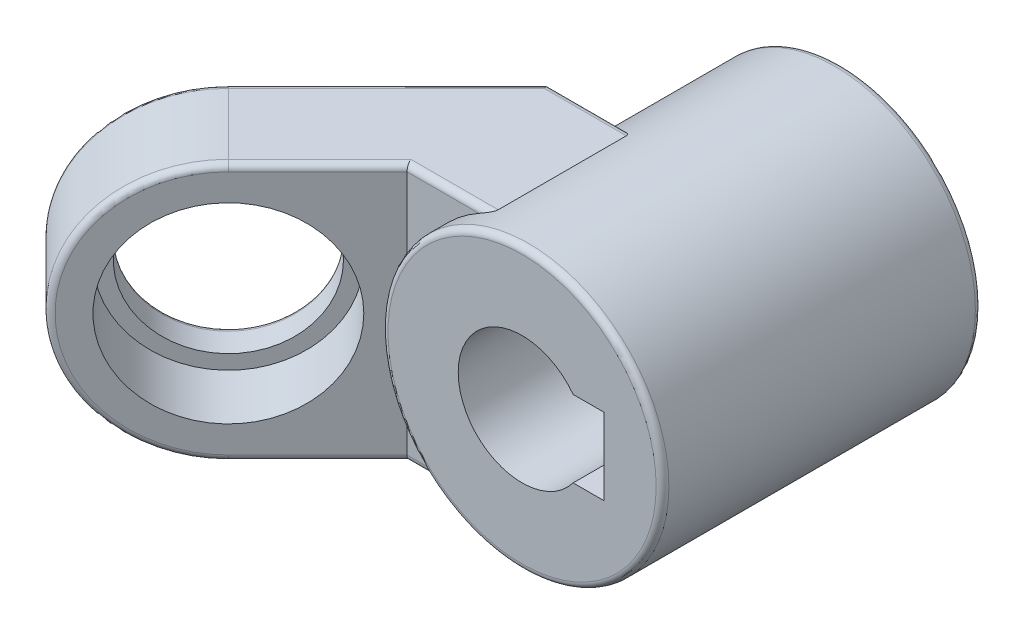
ISO-10303-21;
HEADER;
FILE_DESCRIPTION(('STEP AP214'),'2;1');
FILE_NAME('part.step','',(''),(''),'','','');
FILE_SCHEMA(('AUTOMOTIVE_DESIGN { 1 0 10303 214 1 1 1 1 }'));
ENDSEC;
DATA;
#1=APPLICATION_CONTEXT('core data for automotive mechanical design processes');
#2=APPLICATION_PROTOCOL_DEFINITION('international standard','automotive_design',2000,#1);
#3=PRODUCT_CONTEXT('',#1,'mechanical');
#4=PRODUCT('Part','Part','',(#3));
#5=PRODUCT_RELATED_PRODUCT_CATEGORY('part','',(#4));
#6=PRODUCT_DEFINITION_FORMATION('','',#4);
#7=PRODUCT_DEFINITION_CONTEXT('part definition',#1,'design');
#8=PRODUCT_DEFINITION('design','',#6,#7);
#9=PRODUCT_DEFINITION_SHAPE('','',#8);
#10=(LENGTH_UNIT() NAMED_UNIT(*) SI_UNIT(.MILLI.,.METRE.));
#11=(NAMED_UNIT(*) PLANE_ANGLE_UNIT() SI_UNIT($,.RADIAN.));
#12=(NAMED_UNIT(*) SI_UNIT($,.STERADIAN.) SOLID_ANGLE_UNIT());
#13=UNCERTAINTY_MEASURE_WITH_UNIT(LENGTH_MEASURE(1.E-05),#10,'distance_accuracy_value','');
#14=(GEOMETRIC_REPRESENTATION_CONTEXT(3) GLOBAL_UNCERTAINTY_ASSIGNED_CONTEXT((#13)) GLOBAL_UNIT_ASSIGNED_CONTEXT((#10,
#11,#12)) REPRESENTATION_CONTEXT('',''));
#15=CARTESIAN_POINT('',(0.,0.,0.));
#16=DIRECTION('',(0.,0.,1.));
#17=DIRECTION('',(1.,0.,0.));
#18=AXIS2_PLACEMENT_3D('',#15,#16,#17);
#19=CARTESIAN_POINT('',(-61.3061579288735,20.2,63.2609560310627));
#20=DIRECTION('',(-0.707106781186547,0.,-0.707106781186548));
#21=DIRECTION('',(-0.707106781186548,0.,0.707106781186547));
#22=AXIS2_PLACEMENT_3D('',#19,#20,#21);
#23=PLANE('',#22);
#24=CARTESIAN_POINT('',(-47.0226009489052,0.,48.9773990510944));
#25=DIRECTION('',(-0.707106781186547,0.,-0.707106781186548));
#26=DIRECTION('',(-0.707106781186548,0.,0.707106781186547));
#27=AXIS2_PLACEMENT_3D('',#24,#25,#26);
#28=CIRCLE('',#27,13.75);
#29=CARTESIAN_POINT('',(-56.7453191902202,0.,58.7001172924094));
#30=VERTEX_POINT('',#29);
#31=EDGE_CURVE('E219',#30,#30,#28,.F.);
#32=ORIENTED_EDGE('',*,*,#31,.T.);
#33=EDGE_LOOP('',(#32));
#34=FACE_BOUND('',#33,.T.);
#35=DIRECTION('',(0.,-1.,0.));
#36=VECTOR('',#35,1.);
#37=CARTESIAN_POINT('',(-22.,20.2,23.9547981021892));
#38=LINE('',#37,#36);
#39=CARTESIAN_POINT('',(-22.,0.,23.9547981021892));
#40=VERTEX_POINT('',#39);
#41=CARTESIAN_POINT('',(-22.,-19.2,23.9547981021892));
#42=VERTEX_POINT('',#41);
#43=EDGE_CURVE('E199',#40,#42,#38,.T.);
#44=ORIENTED_EDGE('',*,*,#43,.T.);
#45=DIRECTION('',(0.707106781186548,0.,-0.707106781186547));
#46=VECTOR('',#45,1.);
#47=CARTESIAN_POINT('',(-47.0226009489051,-19.2,48.9773990510943));
#48=LINE('',#47,#46);
#49=CARTESIAN_POINT('',(-47.0226009489051,-19.2,48.9773990510943));
#50=VERTEX_POINT('',#49);
#51=EDGE_CURVE('E236',#42,#50,#48,.F.);
#52=ORIENTED_EDGE('',*,*,#51,.T.);
#53=CARTESIAN_POINT('',(-47.0226009489051,0.,48.9773990510943));
#54=DIRECTION('',(-0.707106781186547,0.,-0.707106781186548));
#55=DIRECTION('',(-0.707106781186548,0.,0.707106781186547));
#56=AXIS2_PLACEMENT_3D('',#53,#54,#55);
#57=CIRCLE('',#56,19.2);
#58=CARTESIAN_POINT('',(-47.0226009489051,19.2,48.9773990510943));
#59=VERTEX_POINT('',#58);
#60=EDGE_CURVE('E234',#50,#59,#57,.T.);
#61=ORIENTED_EDGE('',*,*,#60,.T.);
#62=DIRECTION('',(0.707106781186548,0.,-0.707106781186547));
#63=VECTOR('',#62,1.);
#64=CARTESIAN_POINT('',(-61.3061579288735,19.2,63.2609560310627));
#65=LINE('',#64,#63);
#66=CARTESIAN_POINT('',(-22.,19.2,23.9547981021892));
#67=VERTEX_POINT('',#66);
#68=EDGE_CURVE('E232',#59,#67,#65,.T.);
#69=ORIENTED_EDGE('',*,*,#68,.T.);
#70=EDGE_CURVE('E205',#67,#40,#38,.T.);
#71=ORIENTED_EDGE('',*,*,#70,.T.);
#72=EDGE_LOOP('',(#44,#52,#61,#69,#71));
#73=FACE_BOUND('',#72,.T.);
#74=ADVANCED_FACE('F40',(#34,#73),#23,.T.);
#75=CARTESIAN_POINT('',(-35.9917351623951,20.2,60.0082648376045));
#76=DIRECTION('',(0.707106781186544,0.,0.707106781186551));
#77=DIRECTION('',(0.707106781186551,0.,-0.707106781186544));
#78=AXIS2_PLACEMENT_3D('',#75,#76,#77);
#79=PLANE('',#78);
#80=CARTESIAN_POINT('',(-35.991735162395,0.,60.0082648376046));
#81=DIRECTION('',(0.707106781186544,0.,0.707106781186551));
#82=DIRECTION('',(0.707106781186551,0.,-0.707106781186544));
#83=AXIS2_PLACEMENT_3D('',#80,#81,#82);
#84=CIRCLE('',#83,15.);
#85=CARTESIAN_POINT('',(-25.3851334445968,0.,49.4016631198064));
#86=VERTEX_POINT('',#85);
#87=EDGE_CURVE('E398',#86,#86,#84,.T.);
#88=ORIENTED_EDGE('',*,*,#87,.F.);
#89=EDGE_LOOP('',(#88));
#90=FACE_BOUND('',#89,.T.);
#91=DIRECTION('',(0.,-1.,0.));
#92=VECTOR('',#91,1.);
#93=CARTESIAN_POINT('',(-22.,20.2,46.0165296752096));
#94=LINE('',#93,#92);
#95=CARTESIAN_POINT('',(-22.,19.2,46.0165296752096));
#96=VERTEX_POINT('',#95);
#97=CARTESIAN_POINT('',(-22.,0.,46.0165296752096));
#98=VERTEX_POINT('',#97);
#99=EDGE_CURVE('E200',#96,#98,#94,.T.);
#100=ORIENTED_EDGE('',*,*,#99,.F.);
#101=DIRECTION('',(-0.707106781186551,0.,0.707106781186544));
#102=VECTOR('',#101,1.);
#103=CARTESIAN_POINT('',(-35.9917351623951,19.2,60.0082648376045));
#104=LINE('',#103,#102);
#105=CARTESIAN_POINT('',(-35.991735162395,19.2,60.0082648376045));
#106=VERTEX_POINT('',#105);
#107=EDGE_CURVE('E246',#96,#106,#104,.T.);
#108=ORIENTED_EDGE('',*,*,#107,.T.);
#109=CARTESIAN_POINT('',(-35.9917351623951,0.,60.0082648376045));
#110=DIRECTION('',(0.707106781186544,0.,0.707106781186551));
#111=DIRECTION('',(0.707106781186551,0.,-0.707106781186544));
#112=AXIS2_PLACEMENT_3D('',#109,#110,#111);
#113=CIRCLE('',#112,19.2);
#114=CARTESIAN_POINT('',(-35.991735162395,-19.2,60.0082648376045));
#115=VERTEX_POINT('',#114);
#116=EDGE_CURVE('E244',#106,#115,#113,.T.);
#117=ORIENTED_EDGE('',*,*,#116,.T.);
#118=DIRECTION('',(-0.707106781186551,0.,0.707106781186544));
#119=VECTOR('',#118,1.);
#120=CARTESIAN_POINT('',(-22.,-19.2,46.0165296752096));
#121=LINE('',#120,#119);
#122=CARTESIAN_POINT('',(-22.,-19.2,46.0165296752096));
#123=VERTEX_POINT('',#122);
#124=EDGE_CURVE('E242',#115,#123,#121,.F.);
#125=ORIENTED_EDGE('',*,*,#124,.T.);
#126=EDGE_CURVE('E204',#98,#123,#94,.T.);
#127=ORIENTED_EDGE('',*,*,#126,.F.);
#128=EDGE_LOOP('',(#100,#108,#117,#125,#127));
#129=FACE_BOUND('',#128,.T.);
#130=ADVANCED_FACE('F354',(#90,#129),#79,.T.);
#131=CARTESIAN_POINT('',(12.8,-6.,74.2928218175727));
#132=DIRECTION('',(0.,-1.,0.));
#133=DIRECTION('',(0.,0.,-1.));
#134=AXIS2_PLACEMENT_3D('',#131,#132,#133);
#135=PLANE('',#134);
#136=DIRECTION('',(1.,0.,0.));
#137=VECTOR('',#136,1.);
#138=CARTESIAN_POINT('',(12.8,-6.,2.));
#139=LINE('',#138,#137);
#140=CARTESIAN_POINT('',(8.,-6.,2.));
#141=VERTEX_POINT('',#140);
#142=CARTESIAN_POINT('',(12.8,-6.,2.));
#143=VERTEX_POINT('',#142);
#144=EDGE_CURVE('E165',#141,#143,#139,.T.);
#145=ORIENTED_EDGE('',*,*,#144,.F.);
#146=DIRECTION('',(0.,0.,-1.));
#147=VECTOR('',#146,1.);
#148=CARTESIAN_POINT('',(8.,-6.,74.2928218175727));
#149=LINE('',#148,#147);
#150=CARTESIAN_POINT('',(8.,-6.,50.));
#151=VERTEX_POINT('',#150);
#152=EDGE_CURVE('E179',#151,#141,#149,.T.);
#153=ORIENTED_EDGE('',*,*,#152,.F.);
#154=DIRECTION('',(-1.,0.,0.));
#155=VECTOR('',#154,1.);
#156=CARTESIAN_POINT('',(12.8,-6.,50.));
#157=LINE('',#156,#155);
#158=CARTESIAN_POINT('',(12.8,-6.,50.));
#159=VERTEX_POINT('',#158);
#160=EDGE_CURVE('E190',#159,#151,#157,.T.);
#161=ORIENTED_EDGE('',*,*,#160,.F.);
#162=DIRECTION('',(0.,0.,-1.));
#163=VECTOR('',#162,1.);
#164=CARTESIAN_POINT('',(12.8,-6.,74.2928218175727));
#165=LINE('',#164,#163);
#166=EDGE_CURVE('E182',#159,#143,#165,.T.);
#167=ORIENTED_EDGE('',*,*,#166,.T.);
#168=EDGE_LOOP('',(#145,#153,#161,#167));
#169=FACE_BOUND('',#168,.T.);
#170=ADVANCED_FACE('F178',(#169),#135,.F.);
#171=CARTESIAN_POINT('',(12.8,-6.,74.2928218175727));
#172=DIRECTION('',(1.,0.,0.));
#173=DIRECTION('',(0.,0.,-1.));
#174=AXIS2_PLACEMENT_3D('',#171,#172,#173);
#175=PLANE('',#174);
#176=DIRECTION('',(0.,1.,0.));
#177=VECTOR('',#176,1.);
#178=CARTESIAN_POINT('',(12.8,-6.,2.));
#179=LINE('',#178,#177);
#180=CARTESIAN_POINT('',(12.8,6.,2.));
#181=VERTEX_POINT('',#180);
#182=EDGE_CURVE('E184',#143,#181,#179,.T.);
#183=ORIENTED_EDGE('',*,*,#182,.F.);
#184=ORIENTED_EDGE('',*,*,#166,.F.);
#185=DIRECTION('',(0.,-1.,0.));
#186=VECTOR('',#185,1.);
#187=CARTESIAN_POINT('',(12.8,-6.,50.));
#188=LINE('',#187,#186);
#189=CARTESIAN_POINT('',(12.8,6.,50.));
#190=VERTEX_POINT('',#189);
#191=EDGE_CURVE('E194',#190,#159,#188,.T.);
#192=ORIENTED_EDGE('',*,*,#191,.F.);
#193=DIRECTION('',(0.,0.,-1.));
#194=VECTOR('',#193,1.);
#195=CARTESIAN_POINT('',(12.8,6.,74.2928218175727));
#196=LINE('',#195,#194);
#197=EDGE_CURVE('E192',#190,#181,#196,.T.);
#198=ORIENTED_EDGE('',*,*,#197,.T.);
#199=EDGE_LOOP('',(#183,#184,#192,#198));
#200=FACE_BOUND('',#199,.T.);
#201=ADVANCED_FACE('F412',(#200),#175,.F.);
#202=CARTESIAN_POINT('',(12.8,6.,74.2928218175727));
#203=DIRECTION('',(0.,1.,0.));
#204=DIRECTION('',(0.,0.,1.));
#205=AXIS2_PLACEMENT_3D('',#202,#203,#204);
#206=PLANE('',#205);
#207=DIRECTION('',(-1.,0.,0.));
#208=VECTOR('',#207,1.);
#209=CARTESIAN_POINT('',(12.8,6.,2.));
#210=LINE('',#209,#208);
#211=CARTESIAN_POINT('',(8.,6.,2.));
#212=VERTEX_POINT('',#211);
#213=EDGE_CURVE('E168',#181,#212,#210,.T.);
#214=ORIENTED_EDGE('',*,*,#213,.F.);
#215=ORIENTED_EDGE('',*,*,#197,.F.);
#216=DIRECTION('',(1.,0.,0.));
#217=VECTOR('',#216,1.);
#218=CARTESIAN_POINT('',(12.8,6.,50.));
#219=LINE('',#218,#217);
#220=CARTESIAN_POINT('',(8.,6.,50.));
#221=VERTEX_POINT('',#220);
#222=EDGE_CURVE('E402',#221,#190,#219,.T.);
#223=ORIENTED_EDGE('',*,*,#222,.F.);
#224=DIRECTION('',(0.,0.,-1.));
#225=VECTOR('',#224,1.);
#226=CARTESIAN_POINT('',(8.,6.,74.2928218175727));
#227=LINE('',#226,#225);
#228=EDGE_CURVE('E189',#221,#212,#227,.T.);
#229=ORIENTED_EDGE('',*,*,#228,.T.);
#230=EDGE_LOOP('',(#214,#215,#223,#229));
#231=FACE_BOUND('',#230,.T.);
#232=ADVANCED_FACE('F415',(#231),#206,.F.);
#233=CARTESIAN_POINT('',(0.,0.,74.2928218175727));
#234=DIRECTION('',(0.,0.,-1.));
#235=DIRECTION('',(-1.,0.,0.));
#236=AXIS2_PLACEMENT_3D('',#233,#234,#235);
#237=CYLINDRICAL_SURFACE('',#236,10.);
#238=CARTESIAN_POINT('',(0.,0.,2.));
#239=DIRECTION('',(0.,0.,-1.));
#240=DIRECTION('',(-1.,0.,0.));
#241=AXIS2_PLACEMENT_3D('',#238,#239,#240);
#242=CIRCLE('',#241,10.);
#243=EDGE_CURVE('E162',#212,#141,#242,.F.);
#244=ORIENTED_EDGE('',*,*,#243,.F.);
#245=ORIENTED_EDGE('',*,*,#228,.F.);
#246=CARTESIAN_POINT('',(0.,0.,50.));
#247=DIRECTION('',(0.,0.,1.));
#248=DIRECTION('',(1.,0.,0.));
#249=AXIS2_PLACEMENT_3D('',#246,#247,#248);
#250=CIRCLE('',#249,10.);
#251=EDGE_CURVE('E188',#151,#221,#250,.F.);
#252=ORIENTED_EDGE('',*,*,#251,.F.);
#253=ORIENTED_EDGE('',*,*,#152,.T.);
#254=EDGE_LOOP('',(#244,#245,#252,#253));
#255=FACE_BOUND('',#254,.T.);
#256=ADVANCED_FACE('F186',(#255),#237,.F.);
#257=CARTESIAN_POINT('',(0.,0.,50.));
#258=DIRECTION('',(0.,0.,-1.));
#259=DIRECTION('',(-1.,0.,0.));
#260=AXIS2_PLACEMENT_3D('',#257,#258,#259);
#261=CYLINDRICAL_SURFACE('',#260,22.);
#262=CARTESIAN_POINT('',(0.,0.,1.));
#263=DIRECTION('',(0.,0.,1.));
#264=DIRECTION('',(1.,0.,0.));
#265=AXIS2_PLACEMENT_3D('',#262,#263,#264);
#266=CIRCLE('',#265,22.);
#267=CARTESIAN_POINT('',(22.,0.,1.));
#268=VERTEX_POINT('',#267);
#269=EDGE_CURVE('E260',#268,#268,#266,.T.);
#270=ORIENTED_EDGE('',*,*,#269,.T.);
#271=EDGE_LOOP('',(#270));
#272=FACE_BOUND('',#271,.T.);
#273=CARTESIAN_POINT('',(0.,0.,49.));
#274=DIRECTION('',(0.,0.,1.));
#275=DIRECTION('',(1.,0.,0.));
#276=AXIS2_PLACEMENT_3D('',#273,#274,#275);
#277=CIRCLE('',#276,22.);
#278=CARTESIAN_POINT('',(22.,0.,49.));
#279=VERTEX_POINT('',#278);
#280=EDGE_CURVE('E257',#279,#279,#277,.F.);
#281=ORIENTED_EDGE('',*,*,#280,.T.);
#282=EDGE_LOOP('',(#281));
#283=FACE_BOUND('',#282,.T.);
#284=CARTESIAN_POINT('',(0.,0.,23.9547981021892));
#285=DIRECTION('',(0.,0.,-1.));
#286=DIRECTION('',(-1.,0.,0.));
#287=AXIS2_PLACEMENT_3D('',#284,#285,#286);
#288=CIRCLE('',#287,22.);
#289=CARTESIAN_POINT('',(-10.740577265678,19.2,23.9547981021892));
#290=VERTEX_POINT('',#289);
#291=EDGE_CURVE('E212',#40,#290,#288,.T.);
#292=ORIENTED_EDGE('',*,*,#291,.T.);
#293=CARTESIAN_POINT('',(-10.740577265678,19.2,23.9547981021892));
#294=CARTESIAN_POINT('',(-10.6882289007126,19.2292843573169,23.9548039348407));
#295=CARTESIAN_POINT('',(-10.6357684328551,19.2583494422729,23.9560837718398));
#296=CARTESIAN_POINT('',(-10.5307031862152,19.3160005742744,23.9611264077094));
#297=CARTESIAN_POINT('',(-10.4780984071431,19.3445866203578,23.964889211566));
#298=CARTESIAN_POINT('',(-10.3198401661965,19.4297523417285,23.9798373266985));
#299=CARTESIAN_POINT('',(-10.2140895471856,19.4855456689531,23.9946814966084));
#300=CARTESIAN_POINT('',(-10.0042666632649,19.5940919194298,24.0339327848446));
#301=CARTESIAN_POINT('',(-9.90018862511574,19.6468712262047,24.0582345959994));
#302=CARTESIAN_POINT('',(-9.74535359051707,19.7238791703891,24.1024951303397));
#303=CARTESIAN_POINT('',(-9.69399026740505,19.749171757774,24.1185363137252));
#304=CARTESIAN_POINT('',(-9.59185559878277,19.7989779995456,24.1534542803967));
#305=CARTESIAN_POINT('',(-9.54108414530929,19.823491797445,24.1723305375298));
#306=CARTESIAN_POINT('',(-9.43790634201083,19.8728295400906,24.2142576285816));
#307=CARTESIAN_POINT('',(-9.38554335047809,19.8976088452617,24.2374687728288));
#308=CARTESIAN_POINT('',(-9.28189837681205,19.9461688295162,24.2881093255773));
#309=CARTESIAN_POINT('',(-9.23062524239642,19.9699422645929,24.3155642955126));
#310=CARTESIAN_POINT('',(-9.14778541403854,20.0079814519847,24.3650764734075));
#311=CARTESIAN_POINT('',(-9.11556041665461,20.022681155318,24.3856956483746));
#312=CARTESIAN_POINT('',(-9.05248626053951,20.0512764723129,24.4294299704875));
#313=CARTESIAN_POINT('',(-9.02163625521067,20.0651725823686,24.4525435509436));
#314=CARTESIAN_POINT('',(-8.96210826218821,20.0918309561373,24.5015744532822));
#315=CARTESIAN_POINT('',(-8.93341638521765,20.1046005821336,24.5274706617055));
#316=CARTESIAN_POINT('',(-8.87898116894715,20.1287002195968,24.582745674153));
#317=CARTESIAN_POINT('',(-8.85323025094483,20.1400339399652,24.6121151107116));
#318=CARTESIAN_POINT('',(-8.81338819839304,20.1574926642074,24.6654251068103));
#319=CARTESIAN_POINT('',(-8.79813041800218,20.1641544871142,24.6883076602873));
#320=CARTESIAN_POINT('',(-8.77064729292571,20.1761237685996,24.7361903129747));
#321=CARTESIAN_POINT('',(-8.75842002166757,20.1814320876973,24.7611890532383));
#322=CARTESIAN_POINT('',(-8.73955919561736,20.1896061175486,24.8092557550773));
#323=CARTESIAN_POINT('',(-8.7323641699504,20.1927176907085,24.8320579159716));
#324=CARTESIAN_POINT('',(-8.72160558943268,20.1973669794329,24.8786337005137));
#325=CARTESIAN_POINT('',(-8.71803218770842,20.198908962623,24.9024045062194));
#326=CARTESIAN_POINT('',(-8.71581416268697,20.1998658848031,24.9357914250501));
#327=CARTESIAN_POINT('',(-8.71549667019837,20.200002811566,24.9452963269553));
#328=CARTESIAN_POINT('',(-8.71550342780037,20.2,24.9547981021892));
#329=B_SPLINE_CURVE_WITH_KNOTS('',3,(#293,#294,#295,#296,#297,#298,#299,#300,#301,#302,#303,
#304,#305,#306,#307,#308,#309,#310,#311,#312,#313,#314,#315,#316,#317,#318,#319,#320,#321,#322,
#323,#324,#325,#326,#327,#328),.UNSPECIFIED.,.F.,.F.,(4,2,2,2,2,2,2,2,2,2,2,2,2,2,2,2,2,4),(0.,
0.179917446009924,0.359835253328791,0.720858983658747,1.07797284949514,1.25628609065008,
1.43456627996743,1.62166518027061,1.80993840152554,1.93280875244015,2.05560237503571,
2.1775225266067,2.29912104723692,2.38381063771182,2.46844624993893,2.5404943467173,
2.61234602131346,2.64085523987718),.UNSPECIFIED.);
#330=CARTESIAN_POINT('',(-8.71550342780037,20.2,24.9547981021892));
#331=VERTEX_POINT('',#330);
#332=EDGE_CURVE('E283',#290,#331,#329,.T.);
#333=ORIENTED_EDGE('',*,*,#332,.T.);
#334=DIRECTION('',(0.,0.,-1.));
#335=VECTOR('',#334,1.);
#336=CARTESIAN_POINT('',(-8.71550342780037,20.2,50.));
#337=LINE('',#336,#335);
#338=CARTESIAN_POINT('',(-8.71550342780037,20.2,45.0165296752096));
#339=VERTEX_POINT('',#338);
#340=EDGE_CURVE('E216',#331,#339,#337,.F.);
#341=ORIENTED_EDGE('',*,*,#340,.T.);
#342=CARTESIAN_POINT('',(-8.71550342780037,20.2,45.0165296752096));
#343=CARTESIAN_POINT('',(-8.71543525113145,20.2000281250076,45.0415491696766));
#344=CARTESIAN_POINT('',(-8.71767648182866,20.199062482784,45.0664670926602));
#345=CARTESIAN_POINT('',(-8.72613360473915,20.1954110181934,45.115172048614));
#346=CARTESIAN_POINT('',(-8.73229797546892,20.1927474929154,45.1389695083691));
#347=CARTESIAN_POINT('',(-8.75004519876018,20.1850642225159,45.1912458759619));
#348=CARTESIAN_POINT('',(-8.76262562122633,20.1796095110839,45.2193139343087));
#349=CARTESIAN_POINT('',(-8.79173040785924,20.1669465308051,45.2730052583011));
#350=CARTESIAN_POINT('',(-8.80827615081745,20.1597287522828,45.2986141795532));
#351=CARTESIAN_POINT('',(-8.85643771111859,20.1386341451207,45.3641562261647));
#352=CARTESIAN_POINT('',(-8.89058976773555,20.1235924432766,45.4018221841488));
#353=CARTESIAN_POINT('',(-8.96324678039741,20.0913366328251,45.4714945334503));
#354=CARTESIAN_POINT('',(-9.00176117266578,20.0741178051249,45.503488256567));
#355=CARTESIAN_POINT('',(-9.08377557610419,20.0371445417334,45.5647450045508));
#356=CARTESIAN_POINT('',(-9.12743563266734,20.0173004865912,45.5937360974477));
#357=CARTESIAN_POINT('',(-9.2166477099436,19.9763815936356,45.6477012668382));
#358=CARTESIAN_POINT('',(-9.26220169458948,19.9553054685298,45.672671035702));
#359=CARTESIAN_POINT('',(-9.35476953424316,19.9120794761498,45.7193516842214));
#360=CARTESIAN_POINT('',(-9.4017894453174,19.8899248566117,45.7410460080563));
#361=CARTESIAN_POINT('',(-9.49666389463672,19.844801282565,45.7814783928608));
#362=CARTESIAN_POINT('',(-9.54451814424558,19.8218326069432,45.8002174545085));
#363=CARTESIAN_POINT('',(-9.68766377024424,19.7524755429012,45.8520437360914));
#364=CARTESIAN_POINT('',(-9.78382407056916,19.7050366861706,45.8813594247364));
#365=CARTESIAN_POINT('',(-9.97728539775085,19.6077926783941,45.9312342842143));
#366=CARTESIAN_POINT('',(-10.0745875591627,19.5579849912923,45.9517838243199));
#367=CARTESIAN_POINT('',(-10.266967386624,19.4576676513347,45.9841611910334));
#368=CARTESIAN_POINT('',(-10.3620361460181,19.4072110354995,45.9962044694649));
#369=CARTESIAN_POINT('',(-10.5043426414969,19.3303308198032,46.0083379163466));
#370=CARTESIAN_POINT('',(-10.5516817431803,19.3045311293543,46.0113937188743));
#371=CARTESIAN_POINT('',(-10.6462365619958,19.252546813964,46.0154877198312));
#372=CARTESIAN_POINT('',(-10.6934522766373,19.2263621813224,46.0165258778441));
#373=CARTESIAN_POINT('',(-10.740577265678,19.2,46.0165296752096));
#374=B_SPLINE_CURVE_WITH_KNOTS('',3,(#342,#343,#344,#345,#346,#347,#348,#349,#350,#351,#352,
#353,#354,#355,#356,#357,#358,#359,#360,#361,#362,#363,#364,#365,#366,#367,#368,#369,#370,#371,
#372,#373),.UNSPECIFIED.,.F.,.F.,(4,2,2,2,2,2,2,2,2,2,2,2,2,2,2,4),(0.,0.0747761949646859,
0.148590087813734,0.241779521882191,0.335483155016726,0.493656637700474,0.652179048306914,
0.820040889607787,0.988081364860446,1.15694465037608,1.32575063393964,1.65873976430578,
1.99209378919745,2.31666818237965,2.47863338187732,2.64060182573381),.UNSPECIFIED.);
#375=CARTESIAN_POINT('',(-10.740577265678,19.2,46.0165296752096));
#376=VERTEX_POINT('',#375);
#377=EDGE_CURVE('E49',#339,#376,#374,.T.);
#378=ORIENTED_EDGE('',*,*,#377,.T.);
#379=CARTESIAN_POINT('',(0.,0.,46.0165296752096));
#380=DIRECTION('',(0.,0.,1.));
#381=DIRECTION('',(1.,0.,0.));
#382=AXIS2_PLACEMENT_3D('',#379,#380,#381);
#383=CIRCLE('',#382,22.);
#384=EDGE_CURVE('E215',#376,#98,#383,.T.);
#385=ORIENTED_EDGE('',*,*,#384,.T.);
#386=CARTESIAN_POINT('',(-10.740577265678,-19.2,46.0165296752096));
#387=VERTEX_POINT('',#386);
#388=EDGE_CURVE('E213',#98,#387,#383,.T.);
#389=ORIENTED_EDGE('',*,*,#388,.T.);
#390=CARTESIAN_POINT('',(-10.740577265678,-19.2,46.0165296752096));
#391=CARTESIAN_POINT('',(-10.6882289007126,-19.2292843573169,46.0165238425581));
#392=CARTESIAN_POINT('',(-10.6357684328551,-19.2583494422729,46.015244005559));
#393=CARTESIAN_POINT('',(-10.5307031862152,-19.3160005742744,46.0102013696895));
#394=CARTESIAN_POINT('',(-10.4780984071431,-19.3445866203578,46.0064385658328));
#395=CARTESIAN_POINT('',(-10.3198401661965,-19.4297523417285,45.9914904507003));
#396=CARTESIAN_POINT('',(-10.2140895471856,-19.4855456689531,45.9766462807904));
#397=CARTESIAN_POINT('',(-10.0042666632649,-19.5940919194298,45.9373949925543));
#398=CARTESIAN_POINT('',(-9.90018862511574,-19.6468712262047,45.9130931813995));
#399=CARTESIAN_POINT('',(-9.74535359051707,-19.7238791703891,45.8688326470591));
#400=CARTESIAN_POINT('',(-9.69399026740504,-19.749171757774,45.8527914636737));
#401=CARTESIAN_POINT('',(-9.59185559878277,-19.7989779995456,45.8178734970021));
#402=CARTESIAN_POINT('',(-9.54108414530929,-19.823491797445,45.7989972398691));
#403=CARTESIAN_POINT('',(-9.43790634201082,-19.8728295400906,45.7570701488173));
#404=CARTESIAN_POINT('',(-9.38554335047808,-19.8976088452617,45.73385900457));
#405=CARTESIAN_POINT('',(-9.28189837681205,-19.9461688295162,45.6832184518215));
#406=CARTESIAN_POINT('',(-9.23062524239642,-19.9699422645929,45.6557634818862));
#407=CARTESIAN_POINT('',(-9.14778541403854,-20.0079814519847,45.6062513039913));
#408=CARTESIAN_POINT('',(-9.11556041665461,-20.0226811553181,45.5856321290242));
#409=CARTESIAN_POINT('',(-9.0524862605395,-20.0512764723129,45.5418978069113));
#410=CARTESIAN_POINT('',(-9.02163625521067,-20.0651725823686,45.5187842264552));
#411=CARTESIAN_POINT('',(-8.96210826218821,-20.0918309561373,45.4697533241167));
#412=CARTESIAN_POINT('',(-8.93341638521765,-20.1046005821336,45.4438571156934));
#413=CARTESIAN_POINT('',(-8.87898116894715,-20.1287002195968,45.3885821032458));
#414=CARTESIAN_POINT('',(-8.85323025094482,-20.1400339399652,45.3592126666872));
#415=CARTESIAN_POINT('',(-8.81338819839303,-20.1574926642074,45.3059026705885));
#416=CARTESIAN_POINT('',(-8.79813041800217,-20.1641544871142,45.2830201171116));
#417=CARTESIAN_POINT('',(-8.7706472929257,-20.1761237685996,45.2351374644241));
#418=CARTESIAN_POINT('',(-8.75842002166756,-20.1814320876973,45.2101387241605));
#419=CARTESIAN_POINT('',(-8.73955919561735,-20.1896061175486,45.1620720223215));
#420=CARTESIAN_POINT('',(-8.7323641699504,-20.1927176907085,45.1392698614272));
#421=CARTESIAN_POINT('',(-8.72160558943268,-20.1973669794329,45.0926940768851));
#422=CARTESIAN_POINT('',(-8.71803218770842,-20.198908962623,45.0689232711794));
#423=CARTESIAN_POINT('',(-8.71581416268697,-20.1998658848031,45.0355363523487));
#424=CARTESIAN_POINT('',(-8.71549667019837,-20.200002811566,45.0260314504435));
#425=CARTESIAN_POINT('',(-8.71550342780037,-20.2,45.0165296752096));
#426=B_SPLINE_CURVE_WITH_KNOTS('',3,(#390,#391,#392,#393,#394,#395,#396,#397,#398,#399,#400,
#401,#402,#403,#404,#405,#406,#407,#408,#409,#410,#411,#412,#413,#414,#415,#416,#417,#418,#419,
#420,#421,#422,#423,#424,#425),.UNSPECIFIED.,.F.,.F.,(4,2,2,2,2,2,2,2,2,2,2,2,2,2,2,2,2,4),(0.,
0.179917446009924,0.359835253328789,0.720858983658747,1.07797284949514,1.25628609065009,
1.43456627996743,1.62166518027061,1.80993840152554,1.93280875244016,2.05560237503572,
2.17752252660671,2.29912104723694,2.38381063771183,2.46844624993895,2.54049434671732,
2.61234602131348,2.64085523987717),.UNSPECIFIED.);
#427=CARTESIAN_POINT('',(-8.71550342780037,-20.2,45.0165296752096));
#428=VERTEX_POINT('',#427);
#429=EDGE_CURVE('E11',#387,#428,#426,.T.);
#430=ORIENTED_EDGE('',*,*,#429,.T.);
#431=DIRECTION('',(0.,0.,-1.));
#432=VECTOR('',#431,1.);
#433=CARTESIAN_POINT('',(-8.71550342780037,-20.2,50.));
#434=LINE('',#433,#432);
#435=CARTESIAN_POINT('',(-8.71550342780037,-20.2,24.9547981021892));
#436=VERTEX_POINT('',#435);
#437=EDGE_CURVE('E203',#436,#428,#434,.F.);
#438=ORIENTED_EDGE('',*,*,#437,.F.);
#439=CARTESIAN_POINT('',(-8.71550342780037,-20.2,24.9547981021892));
#440=CARTESIAN_POINT('',(-8.71543525113145,-20.2000281250076,24.9297786077222));
#441=CARTESIAN_POINT('',(-8.71767648182865,-20.199062482784,24.9048606847386));
#442=CARTESIAN_POINT('',(-8.72613360473914,-20.1954110181934,24.8561557287848));
#443=CARTESIAN_POINT('',(-8.73229797546892,-20.1927474929154,24.8323582690297));
#444=CARTESIAN_POINT('',(-8.75004519876018,-20.1850642225159,24.780081901437));
#445=CARTESIAN_POINT('',(-8.76262562122632,-20.1796095110839,24.7520138430901));
#446=CARTESIAN_POINT('',(-8.79173040785923,-20.1669465308051,24.6983225190978));
#447=CARTESIAN_POINT('',(-8.80827615081745,-20.1597287522828,24.6727135978457));
#448=CARTESIAN_POINT('',(-8.85643771111859,-20.1386341451207,24.6071715512341));
#449=CARTESIAN_POINT('',(-8.89058976773554,-20.1235924432766,24.56950559325));
#450=CARTESIAN_POINT('',(-8.96324678039739,-20.0913366328251,24.4998332439486));
#451=CARTESIAN_POINT('',(-9.00176117266576,-20.0741178051249,24.4678395208318));
#452=CARTESIAN_POINT('',(-9.08377557610416,-20.0371445417334,24.4065827728481));
#453=CARTESIAN_POINT('',(-9.12743563266731,-20.0173004865912,24.3775916799511));
#454=CARTESIAN_POINT('',(-9.21664770994356,-19.9763815936356,24.3236265105607));
#455=CARTESIAN_POINT('',(-9.26220169458944,-19.9553054685298,24.2986567416968));
#456=CARTESIAN_POINT('',(-9.3547695342431,-19.9120794761498,24.2519760931775));
#457=CARTESIAN_POINT('',(-9.40178944531734,-19.8899248566118,24.2302817693426));
#458=CARTESIAN_POINT('',(-9.49666389463665,-19.844801282565,24.1898493845381));
#459=CARTESIAN_POINT('',(-9.54451814424551,-19.8218326069433,24.1711103228903));
#460=CARTESIAN_POINT('',(-9.68766377024417,-19.7524755429013,24.1192840413074));
#461=CARTESIAN_POINT('',(-9.7838240705691,-19.7050366861706,24.0899683526624));
#462=CARTESIAN_POINT('',(-9.9772853977508,-19.6077926783941,24.0400934931846));
#463=CARTESIAN_POINT('',(-10.0745875591626,-19.5579849912923,24.019543953079));
#464=CARTESIAN_POINT('',(-10.2669673866239,-19.4576676513347,23.9871665863654));
#465=CARTESIAN_POINT('',(-10.3620361460181,-19.4072110354995,23.975123307934));
#466=CARTESIAN_POINT('',(-10.5043426414968,-19.3303308198032,23.9629898610523));
#467=CARTESIAN_POINT('',(-10.5516817431803,-19.3045311293543,23.9599340585245));
#468=CARTESIAN_POINT('',(-10.6462365619958,-19.2525468139641,23.9558400575676));
#469=CARTESIAN_POINT('',(-10.6934522766373,-19.2263621813224,23.9548018995547));
#470=CARTESIAN_POINT('',(-10.740577265678,-19.2,23.9547981021892));
#471=B_SPLINE_CURVE_WITH_KNOTS('',3,(#439,#440,#441,#442,#443,#444,#445,#446,#447,#448,#449,
#450,#451,#452,#453,#454,#455,#456,#457,#458,#459,#460,#461,#462,#463,#464,#465,#466,#467,#468,
#469,#470),.UNSPECIFIED.,.F.,.F.,(4,2,2,2,2,2,2,2,2,2,2,2,2,2,2,4),(0.,0.0747761949646854,
0.148590087813734,0.241779521882198,0.335483155016718,0.493656637700457,0.652179048306887,
0.820040889607746,0.988081364860392,1.15694465037601,1.32575063393956,1.65873976430572,
1.99209378919742,2.31666818237963,2.47863338187731,2.64060182573381),.UNSPECIFIED.);
#472=CARTESIAN_POINT('',(-10.740577265678,-19.2,23.9547981021892));
#473=VERTEX_POINT('',#472);
#474=EDGE_CURVE('E57',#436,#473,#471,.T.);
#475=ORIENTED_EDGE('',*,*,#474,.T.);
#476=EDGE_CURVE('E210',#473,#40,#288,.T.);
#477=ORIENTED_EDGE('',*,*,#476,.T.);
#478=EDGE_LOOP('',(#292,#333,#341,#378,#385,#389,#430,#438,#475,#477));
#479=FACE_BOUND('',#478,.T.);
#480=ADVANCED_FACE('F290',(#272,#283,#479),#261,.T.);
#481=CARTESIAN_POINT('',(0.,0.,50.));
#482=DIRECTION('',(0.,0.,1.));
#483=DIRECTION('',(1.,0.,0.));
#484=AXIS2_PLACEMENT_3D('',#481,#482,#483);
#485=PLANE('',#484);
#486=CARTESIAN_POINT('',(0.,0.,50.));
#487=DIRECTION('',(0.,0.,1.));
#488=DIRECTION('',(1.,0.,0.));
#489=AXIS2_PLACEMENT_3D('',#486,#487,#488);
#490=CIRCLE('',#489,21.);
#491=CARTESIAN_POINT('',(21.,0.,50.));
#492=VERTEX_POINT('',#491);
#493=EDGE_CURVE('E266',#492,#492,#490,.T.);
#494=ORIENTED_EDGE('',*,*,#493,.T.);
#495=EDGE_LOOP('',(#494));
#496=FACE_BOUND('',#495,.T.);
#497=ORIENTED_EDGE('',*,*,#160,.T.);
#498=ORIENTED_EDGE('',*,*,#251,.T.);
#499=ORIENTED_EDGE('',*,*,#222,.T.);
#500=ORIENTED_EDGE('',*,*,#191,.T.);
#501=EDGE_LOOP('',(#497,#498,#499,#500));
#502=FACE_BOUND('',#501,.T.);
#503=ADVANCED_FACE('F367',(#496,#502),#485,.T.);
#504=CARTESIAN_POINT('',(0.,0.,0.));
#505=DIRECTION('',(0.,0.,1.));
#506=DIRECTION('',(1.,0.,0.));
#507=AXIS2_PLACEMENT_3D('',#504,#505,#506);
#508=PLANE('',#507);
#509=CARTESIAN_POINT('',(0.,0.,0.));
#510=DIRECTION('',(0.,0.,1.));
#511=DIRECTION('',(1.,0.,0.));
#512=AXIS2_PLACEMENT_3D('',#509,#510,#511);
#513=CIRCLE('',#512,21.);
#514=CARTESIAN_POINT('',(21.,0.,0.));
#515=VERTEX_POINT('',#514);
#516=EDGE_CURVE('E263',#515,#515,#513,.F.);
#517=ORIENTED_EDGE('',*,*,#516,.T.);
#518=EDGE_LOOP('',(#517));
#519=FACE_BOUND('',#518,.T.);
#520=CARTESIAN_POINT('',(0.,0.,0.));
#521=DIRECTION('',(0.,0.,-1.));
#522=DIRECTION('',(-1.,0.,0.));
#523=AXIS2_PLACEMENT_3D('',#520,#521,#522);
#524=CIRCLE('',#523,18.);
#525=CARTESIAN_POINT('',(-18.,0.,0.));
#526=VERTEX_POINT('',#525);
#527=EDGE_CURVE('E383',#526,#526,#524,.T.);
#528=ORIENTED_EDGE('',*,*,#527,.F.);
#529=EDGE_LOOP('',(#528));
#530=FACE_BOUND('',#529,.T.);
#531=ADVANCED_FACE('F369',(#519,#530),#508,.F.);
#532=CARTESIAN_POINT('',(0.,20.2,46.0165296752096));
#533=DIRECTION('',(0.,0.,1.));
#534=DIRECTION('',(1.,0.,0.));
#535=AXIS2_PLACEMENT_3D('',#532,#533,#534);
#536=PLANE('',#535);
#537=ORIENTED_EDGE('',*,*,#384,.F.);
#538=DIRECTION('',(-1.,0.,0.));
#539=VECTOR('',#538,1.);
#540=CARTESIAN_POINT('',(0.,19.2,46.0165296752096));
#541=LINE('',#540,#539);
#542=EDGE_CURVE('E273',#376,#96,#541,.T.);
#543=ORIENTED_EDGE('',*,*,#542,.T.);
#544=ORIENTED_EDGE('',*,*,#99,.T.);
#545=EDGE_LOOP('',(#537,#543,#544));
#546=FACE_BOUND('',#545,.T.);
#547=ADVANCED_FACE('F372',(#546),#536,.T.);
#548=CARTESIAN_POINT('',(-22.,20.2,23.9547981021892));
#549=DIRECTION('',(0.,0.,-1.));
#550=DIRECTION('',(-1.,0.,0.));
#551=AXIS2_PLACEMENT_3D('',#548,#549,#550);
#552=PLANE('',#551);
#553=ORIENTED_EDGE('',*,*,#70,.F.);
#554=DIRECTION('',(1.,0.,0.));
#555=VECTOR('',#554,1.);
#556=CARTESIAN_POINT('',(-22.,19.2,23.9547981021892));
#557=LINE('',#556,#555);
#558=EDGE_CURVE('E271',#67,#290,#557,.T.);
#559=ORIENTED_EDGE('',*,*,#558,.T.);
#560=ORIENTED_EDGE('',*,*,#291,.F.);
#561=EDGE_LOOP('',(#553,#559,#560));
#562=FACE_BOUND('',#561,.T.);
#563=ADVANCED_FACE('F377',(#562),#552,.T.);
#564=CARTESIAN_POINT('',(0.,20.2,0.));
#565=DIRECTION('',(0.,1.,0.));
#566=DIRECTION('',(0.,0.,1.));
#567=AXIS2_PLACEMENT_3D('',#564,#565,#566);
#568=PLANE('',#567);
#569=ORIENTED_EDGE('',*,*,#340,.F.);
#570=DIRECTION('',(1.,0.,0.));
#571=VECTOR('',#570,1.);
#572=CARTESIAN_POINT('',(0.,20.2,24.9547981021892));
#573=LINE('',#572,#571);
#574=CARTESIAN_POINT('',(-21.5857864376269,20.2,24.9547981021892));
#575=VERTEX_POINT('',#574);
#576=EDGE_CURVE('E255',#331,#575,#573,.F.);
#577=ORIENTED_EDGE('',*,*,#576,.T.);
#578=DIRECTION('',(0.707106781186548,0.,-0.707106781186547));
#579=VECTOR('',#578,1.);
#580=CARTESIAN_POINT('',(1.68450583228117,20.2,1.68450583228117));
#581=LINE('',#580,#579);
#582=CARTESIAN_POINT('',(-46.3154941677186,20.2,49.6845058322809));
#583=VERTEX_POINT('',#582);
#584=EDGE_CURVE('E253',#575,#583,#581,.F.);
#585=ORIENTED_EDGE('',*,*,#584,.T.);
#586=DIRECTION('',(0.707106781186544,0.,0.707106781186551));
#587=VECTOR('',#586,1.);
#588=CARTESIAN_POINT('',(-78.6540789644364,20.2,17.3459210355628));
#589=LINE('',#588,#587);
#590=CARTESIAN_POINT('',(-36.6988419435816,20.2,59.301158056418));
#591=VERTEX_POINT('',#590);
#592=EDGE_CURVE('E391',#583,#591,#589,.T.);
#593=ORIENTED_EDGE('',*,*,#592,.T.);
#594=DIRECTION('',(-0.707106781186551,0.,0.707106781186544));
#595=VECTOR('',#594,1.);
#596=CARTESIAN_POINT('',(11.3011580564184,20.2,11.3011580564185));
#597=LINE('',#596,#595);
#598=CARTESIAN_POINT('',(-22.4142135623731,20.2,45.0165296752096));
#599=VERTEX_POINT('',#598);
#600=EDGE_CURVE('E251',#591,#599,#597,.F.);
#601=ORIENTED_EDGE('',*,*,#600,.T.);
#602=DIRECTION('',(-1.,0.,0.));
#603=VECTOR('',#602,1.);
#604=CARTESIAN_POINT('',(0.,20.2,45.0165296752096));
#605=LINE('',#604,#603);
#606=EDGE_CURVE('E249',#599,#339,#605,.F.);
#607=ORIENTED_EDGE('',*,*,#606,.T.);
#608=EDGE_LOOP('',(#569,#577,#585,#593,#601,#607));
#609=FACE_BOUND('',#608,.T.);
#610=ADVANCED_FACE('F432',(#609),#568,.T.);
#611=CARTESIAN_POINT('',(0.,-20.2,0.));
#612=DIRECTION('',(0.,1.,0.));
#613=DIRECTION('',(0.,0.,1.));
#614=AXIS2_PLACEMENT_3D('',#611,#612,#613);
#615=PLANE('',#614);
#616=DIRECTION('',(0.707106781186544,0.,0.707106781186551));
#617=VECTOR('',#616,1.);
#618=CARTESIAN_POINT('',(-78.6540789644364,-20.2,17.3459210355628));
#619=LINE('',#618,#617);
#620=CARTESIAN_POINT('',(-46.3154941677186,-20.2,49.6845058322809));
#621=VERTEX_POINT('',#620);
#622=CARTESIAN_POINT('',(-36.6988419435816,-20.2,59.301158056418));
#623=VERTEX_POINT('',#622);
#624=EDGE_CURVE('E386',#621,#623,#619,.T.);
#625=ORIENTED_EDGE('',*,*,#624,.F.);
#626=DIRECTION('',(0.707106781186548,0.,-0.707106781186547));
#627=VECTOR('',#626,1.);
#628=CARTESIAN_POINT('',(-21.2928932188135,-20.2,24.6619048833758));
#629=LINE('',#628,#627);
#630=CARTESIAN_POINT('',(-21.5857864376269,-20.2,24.9547981021892));
#631=VERTEX_POINT('',#630);
#632=EDGE_CURVE('E229',#621,#631,#629,.T.);
#633=ORIENTED_EDGE('',*,*,#632,.T.);
#634=DIRECTION('',(1.,0.,0.));
#635=VECTOR('',#634,1.);
#636=CARTESIAN_POINT('',(-8.71550342780037,-20.2,24.9547981021892));
#637=LINE('',#636,#635);
#638=EDGE_CURVE('E227',#631,#436,#637,.T.);
#639=ORIENTED_EDGE('',*,*,#638,.T.);
#640=ORIENTED_EDGE('',*,*,#437,.T.);
#641=DIRECTION('',(-1.,0.,0.));
#642=VECTOR('',#641,1.);
#643=CARTESIAN_POINT('',(-22.,-20.2,45.0165296752096));
#644=LINE('',#643,#642);
#645=CARTESIAN_POINT('',(-22.4142135623731,-20.2,45.0165296752096));
#646=VERTEX_POINT('',#645);
#647=EDGE_CURVE('E225',#428,#646,#644,.T.);
#648=ORIENTED_EDGE('',*,*,#647,.T.);
#649=DIRECTION('',(-0.707106781186551,0.,0.707106781186544));
#650=VECTOR('',#649,1.);
#651=CARTESIAN_POINT('',(-36.6988419435816,-20.2,59.301158056418));
#652=LINE('',#651,#650);
#653=EDGE_CURVE('E172',#646,#623,#652,.T.);
#654=ORIENTED_EDGE('',*,*,#653,.T.);
#655=EDGE_LOOP('',(#625,#633,#639,#640,#648,#654));
#656=FACE_BOUND('',#655,.T.);
#657=ADVANCED_FACE('F429',(#656),#615,.F.);
#658=ORIENTED_EDGE('',*,*,#126,.T.);
#659=DIRECTION('',(-1.,0.,0.));
#660=VECTOR('',#659,1.);
#661=CARTESIAN_POINT('',(-8.71550342780037,-19.2,46.0165296752096));
#662=LINE('',#661,#660);
#663=EDGE_CURVE('E65',#123,#387,#662,.F.);
#664=ORIENTED_EDGE('',*,*,#663,.T.);
#665=ORIENTED_EDGE('',*,*,#388,.F.);
#666=EDGE_LOOP('',(#658,#664,#665));
#667=FACE_BOUND('',#666,.T.);
#668=ADVANCED_FACE('F379',(#667),#536,.T.);
#669=ORIENTED_EDGE('',*,*,#476,.F.);
#670=DIRECTION('',(1.,0.,0.));
#671=VECTOR('',#670,1.);
#672=CARTESIAN_POINT('',(-22.,-19.2,23.9547981021892));
#673=LINE('',#672,#671);
#674=EDGE_CURVE('E269',#473,#42,#673,.F.);
#675=ORIENTED_EDGE('',*,*,#674,.T.);
#676=ORIENTED_EDGE('',*,*,#43,.F.);
#677=EDGE_LOOP('',(#669,#675,#676));
#678=FACE_BOUND('',#677,.T.);
#679=ADVANCED_FACE('F364',(#678),#552,.T.);
#680=CARTESIAN_POINT('',(-43.2749350086165,0.,52.7250649913831));
#681=DIRECTION('',(0.707106781186544,0.,0.707106781186551));
#682=DIRECTION('',(0.707106781186551,0.,-0.707106781186544));
#683=AXIS2_PLACEMENT_3D('',#680,#681,#682);
#684=CYLINDRICAL_SURFACE('',#683,15.);
#685=CARTESIAN_POINT('',(-43.2749350086165,0.,52.7250649913831));
#686=DIRECTION('',(0.707106781186544,0.,0.707106781186551));
#687=DIRECTION('',(0.707106781186551,0.,-0.707106781186544));
#688=AXIS2_PLACEMENT_3D('',#685,#686,#687);
#689=CIRCLE('',#688,15.);
#690=CARTESIAN_POINT('',(-32.6683332908182,0.,42.1184632735849));
#691=VERTEX_POINT('',#690);
#692=EDGE_CURVE('E399',#691,#691,#689,.T.);
#693=ORIENTED_EDGE('',*,*,#692,.F.);
#694=EDGE_LOOP('',(#693));
#695=FACE_BOUND('',#694,.T.);
#696=ORIENTED_EDGE('',*,*,#87,.T.);
#697=EDGE_LOOP('',(#696));
#698=FACE_BOUND('',#697,.T.);
#699=ADVANCED_FACE('F440',(#695,#698),#684,.F.);
#700=CARTESIAN_POINT('',(-43.2749350086165,0.,52.7250649913831));
#701=DIRECTION('',(0.707106781186544,0.,0.707106781186551));
#702=DIRECTION('',(0.707106781186551,0.,-0.707106781186544));
#703=AXIS2_PLACEMENT_3D('',#700,#701,#702);
#704=PLANE('',#703);
#705=CARTESIAN_POINT('',(-43.2749350086164,0.,52.7250649913831));
#706=DIRECTION('',(0.707106781186544,0.,0.707106781186551));
#707=DIRECTION('',(0.707106781186551,0.,-0.707106781186544));
#708=AXIS2_PLACEMENT_3D('',#705,#706,#707);
#709=CIRCLE('',#708,12.75);
#710=CARTESIAN_POINT('',(-34.2593235484879,0.,43.7094535312546));
#711=VERTEX_POINT('',#710);
#712=EDGE_CURVE('E183',#711,#711,#709,.T.);
#713=ORIENTED_EDGE('',*,*,#712,.F.);
#714=EDGE_LOOP('',(#713));
#715=FACE_BOUND('',#714,.T.);
#716=ORIENTED_EDGE('',*,*,#692,.T.);
#717=EDGE_LOOP('',(#716));
#718=FACE_BOUND('',#717,.T.);
#719=ADVANCED_FACE('F522',(#715,#718),#704,.T.);
#720=CARTESIAN_POINT('',(-78.6540789644364,0.,17.3459210355628));
#721=DIRECTION('',(0.707106781186544,0.,0.707106781186551));
#722=DIRECTION('',(0.707106781186551,0.,-0.707106781186544));
#723=AXIS2_PLACEMENT_3D('',#720,#721,#722);
#724=CYLINDRICAL_SURFACE('',#723,12.75);
#725=CARTESIAN_POINT('',(-46.3154941677186,0.,49.6845058322809));
#726=DIRECTION('',(-0.707106781186547,0.,-0.707106781186548));
#727=DIRECTION('',(-0.707106781186548,0.,0.707106781186547));
#728=AXIS2_PLACEMENT_3D('',#725,#726,#727);
#729=CIRCLE('',#728,12.75);
#730=CARTESIAN_POINT('',(-55.3311056278471,0.,58.7001172924094));
#731=VERTEX_POINT('',#730);
#732=EDGE_CURVE('E173',#731,#731,#729,.T.);
#733=ORIENTED_EDGE('',*,*,#732,.T.);
#734=EDGE_LOOP('',(#733));
#735=FACE_BOUND('',#734,.T.);
#736=ORIENTED_EDGE('',*,*,#712,.T.);
#737=EDGE_LOOP('',(#736));
#738=FACE_BOUND('',#737,.T.);
#739=ADVANCED_FACE('F519',(#735,#738),#724,.F.);
#740=CARTESIAN_POINT('',(-46.3154941677186,0.,49.6845058322809));
#741=DIRECTION('',(-0.707106781186547,0.,-0.707106781186548));
#742=DIRECTION('',(-0.707106781186548,0.,0.707106781186547));
#743=AXIS2_PLACEMENT_3D('',#740,#741,#742);
#744=TOROIDAL_SURFACE('',#743,13.75,1.);
#745=ORIENTED_EDGE('',*,*,#732,.F.);
#746=EDGE_LOOP('',(#745));
#747=FACE_BOUND('',#746,.T.);
#748=ORIENTED_EDGE('',*,*,#31,.F.);
#749=EDGE_LOOP('',(#748));
#750=FACE_BOUND('',#749,.T.);
#751=ADVANCED_FACE('F516',(#747,#750),#744,.T.);
#752=CARTESIAN_POINT('',(0.,0.,2.));
#753=DIRECTION('',(0.,0.,-1.));
#754=DIRECTION('',(-1.,0.,0.));
#755=AXIS2_PLACEMENT_3D('',#752,#753,#754);
#756=PLANE('',#755);
#757=CARTESIAN_POINT('',(0.,0.,2.));
#758=DIRECTION('',(0.,0.,-1.));
#759=DIRECTION('',(-1.,0.,0.));
#760=AXIS2_PLACEMENT_3D('',#757,#758,#759);
#761=CIRCLE('',#760,18.);
#762=CARTESIAN_POINT('',(-18.,0.,2.));
#763=VERTEX_POINT('',#762);
#764=EDGE_CURVE('E385',#763,#763,#761,.T.);
#765=ORIENTED_EDGE('',*,*,#764,.T.);
#766=EDGE_LOOP('',(#765));
#767=FACE_BOUND('',#766,.T.);
#768=ORIENTED_EDGE('',*,*,#144,.T.);
#769=ORIENTED_EDGE('',*,*,#182,.T.);
#770=ORIENTED_EDGE('',*,*,#213,.T.);
#771=ORIENTED_EDGE('',*,*,#243,.T.);
#772=EDGE_LOOP('',(#768,#769,#770,#771));
#773=FACE_BOUND('',#772,.T.);
#774=ADVANCED_FACE('F164',(#767,#773),#756,.T.);
#775=CARTESIAN_POINT('',(0.,0.,2.));
#776=DIRECTION('',(0.,0.,-1.));
#777=DIRECTION('',(-1.,0.,0.));
#778=AXIS2_PLACEMENT_3D('',#775,#776,#777);
#779=CYLINDRICAL_SURFACE('',#778,18.);
#780=ORIENTED_EDGE('',*,*,#764,.F.);
#781=EDGE_LOOP('',(#780));
#782=FACE_BOUND('',#781,.T.);
#783=ORIENTED_EDGE('',*,*,#527,.T.);
#784=EDGE_LOOP('',(#783));
#785=FACE_BOUND('',#784,.T.);
#786=ADVANCED_FACE('F507',(#782,#785),#779,.F.);
#787=CARTESIAN_POINT('',(-78.6540789644364,0.,17.3459210355628));
#788=DIRECTION('',(0.707106781186544,0.,0.707106781186551));
#789=DIRECTION('',(0.707106781186551,0.,-0.707106781186544));
#790=AXIS2_PLACEMENT_3D('',#787,#788,#789);
#791=CYLINDRICAL_SURFACE('',#790,20.2);
#792=ORIENTED_EDGE('',*,*,#592,.F.);
#793=CARTESIAN_POINT('',(-46.3154941677186,0.,49.6845058322809));
#794=DIRECTION('',(-0.707106781186547,0.,-0.707106781186548));
#795=DIRECTION('',(-0.707106781186548,0.,0.707106781186547));
#796=AXIS2_PLACEMENT_3D('',#793,#794,#795);
#797=CIRCLE('',#796,20.2);
#798=EDGE_CURVE('E240',#583,#621,#797,.F.);
#799=ORIENTED_EDGE('',*,*,#798,.T.);
#800=ORIENTED_EDGE('',*,*,#624,.T.);
#801=CARTESIAN_POINT('',(-36.6988419435816,0.,59.301158056418));
#802=DIRECTION('',(0.707106781186544,0.,0.707106781186551));
#803=DIRECTION('',(0.707106781186551,0.,-0.707106781186544));
#804=AXIS2_PLACEMENT_3D('',#801,#802,#803);
#805=CIRCLE('',#804,20.2);
#806=EDGE_CURVE('E238',#623,#591,#805,.F.);
#807=ORIENTED_EDGE('',*,*,#806,.T.);
#808=EDGE_LOOP('',(#792,#799,#800,#807));
#809=FACE_BOUND('',#808,.T.);
#810=ADVANCED_FACE('F312',(#809),#791,.T.);
#811=CARTESIAN_POINT('',(-22.,19.2,24.9547981021892));
#812=DIRECTION('',(1.,0.,0.));
#813=DIRECTION('',(0.,0.,-1.));
#814=AXIS2_PLACEMENT_3D('',#811,#812,#813);
#815=CYLINDRICAL_SURFACE('',#814,1.);
#816=ORIENTED_EDGE('',*,*,#332,.F.);
#817=ORIENTED_EDGE('',*,*,#558,.F.);
#818=CARTESIAN_POINT('',(-21.5857864376269,19.2,24.9547981021892));
#819=DIRECTION('',(0.923879532511287,0.,-0.38268343236509));
#820=DIRECTION('',(-0.38268343236509,0.,-0.923879532511287));
#821=AXIS2_PLACEMENT_3D('',#818,#819,#820);
#822=ELLIPSE('',#821,1.08239220029239,1.);
#823=EDGE_CURVE('E464',#575,#67,#822,.F.);
#824=ORIENTED_EDGE('',*,*,#823,.F.);
#825=ORIENTED_EDGE('',*,*,#576,.F.);
#826=EDGE_LOOP('',(#816,#817,#824,#825));
#827=FACE_BOUND('',#826,.T.);
#828=ADVANCED_FACE('F307',(#827),#815,.T.);
#829=CARTESIAN_POINT('',(-60.5990511476869,19.2,63.9680628122492));
#830=DIRECTION('',(0.707106781186548,0.,-0.707106781186547));
#831=DIRECTION('',(-0.707106781186547,0.,-0.707106781186548));
#832=AXIS2_PLACEMENT_3D('',#829,#830,#831);
#833=CYLINDRICAL_SURFACE('',#832,1.);
#834=ORIENTED_EDGE('',*,*,#823,.T.);
#835=ORIENTED_EDGE('',*,*,#68,.F.);
#836=CARTESIAN_POINT('',(-46.3154941677186,19.2,49.6845058322809));
#837=DIRECTION('',(-0.707106781186547,0.,0.707106781186547));
#838=DIRECTION('',(0.707106781186548,0.,0.707106781186548));
#839=AXIS2_PLACEMENT_3D('',#836,#837,#838);
#840=CIRCLE('',#839,1.);
#841=EDGE_CURVE('E467',#583,#59,#840,.T.);
#842=ORIENTED_EDGE('',*,*,#841,.F.);
#843=ORIENTED_EDGE('',*,*,#584,.F.);
#844=EDGE_LOOP('',(#834,#835,#842,#843));
#845=FACE_BOUND('',#844,.T.);
#846=ADVANCED_FACE('F304',(#845),#833,.T.);
#847=CARTESIAN_POINT('',(-46.3154941677186,0.,49.6845058322809));
#848=DIRECTION('',(-0.707106781186547,0.,-0.707106781186548));
#849=DIRECTION('',(-0.707106781186548,0.,0.707106781186547));
#850=AXIS2_PLACEMENT_3D('',#847,#848,#849);
#851=TOROIDAL_SURFACE('',#850,19.2,1.);
#852=ORIENTED_EDGE('',*,*,#841,.T.);
#853=ORIENTED_EDGE('',*,*,#60,.F.);
#854=CARTESIAN_POINT('',(-46.3154941677186,-19.2,49.6845058322809));
#855=DIRECTION('',(0.707106781186547,0.,-0.707106781186547));
#856=DIRECTION('',(-0.707106781186548,0.,-0.707106781186548));
#857=AXIS2_PLACEMENT_3D('',#854,#855,#856);
#858=CIRCLE('',#857,1.);
#859=EDGE_CURVE('E455',#621,#50,#858,.T.);
#860=ORIENTED_EDGE('',*,*,#859,.F.);
#861=ORIENTED_EDGE('',*,*,#798,.F.);
#862=EDGE_LOOP('',(#852,#853,#860,#861));
#863=FACE_BOUND('',#862,.T.);
#864=ADVANCED_FACE('F300',(#863),#851,.T.);
#865=CARTESIAN_POINT('',(0.,-19.2,24.9547981021892));
#866=DIRECTION('',(-1.,0.,0.));
#867=DIRECTION('',(0.,0.,1.));
#868=AXIS2_PLACEMENT_3D('',#865,#866,#867);
#869=CYLINDRICAL_SURFACE('',#868,1.);
#870=ORIENTED_EDGE('',*,*,#474,.F.);
#871=ORIENTED_EDGE('',*,*,#638,.F.);
#872=CARTESIAN_POINT('',(-21.5857864376269,-19.2,24.9547981021892));
#873=DIRECTION('',(-0.923879532511287,0.,0.38268343236509));
#874=DIRECTION('',(-0.38268343236509,0.,-0.923879532511287));
#875=AXIS2_PLACEMENT_3D('',#872,#873,#874);
#876=ELLIPSE('',#875,1.08239220029239,1.);
#877=EDGE_CURVE('E339',#42,#631,#876,.T.);
#878=ORIENTED_EDGE('',*,*,#877,.F.);
#879=ORIENTED_EDGE('',*,*,#674,.F.);
#880=EDGE_LOOP('',(#870,#871,#878,#879));
#881=FACE_BOUND('',#880,.T.);
#882=ADVANCED_FACE('F294',(#881),#869,.T.);
#883=CARTESIAN_POINT('',(1.68450583228117,-19.2,1.68450583228117));
#884=DIRECTION('',(-0.707106781186548,0.,0.707106781186547));
#885=DIRECTION('',(0.707106781186547,0.,0.707106781186548));
#886=AXIS2_PLACEMENT_3D('',#883,#884,#885);
#887=CYLINDRICAL_SURFACE('',#886,1.);
#888=ORIENTED_EDGE('',*,*,#859,.T.);
#889=ORIENTED_EDGE('',*,*,#51,.F.);
#890=ORIENTED_EDGE('',*,*,#877,.T.);
#891=ORIENTED_EDGE('',*,*,#632,.F.);
#892=EDGE_LOOP('',(#888,#889,#890,#891));
#893=FACE_BOUND('',#892,.T.);
#894=ADVANCED_FACE('F299',(#893),#887,.T.);
#895=CARTESIAN_POINT('',(0.,-19.2,45.0165296752096));
#896=DIRECTION('',(1.,0.,0.));
#897=DIRECTION('',(0.,0.,-1.));
#898=AXIS2_PLACEMENT_3D('',#895,#896,#897);
#899=CYLINDRICAL_SURFACE('',#898,1.);
#900=ORIENTED_EDGE('',*,*,#429,.F.);
#901=ORIENTED_EDGE('',*,*,#663,.F.);
#902=CARTESIAN_POINT('',(-22.4142135623731,-19.2,45.0165296752096));
#903=DIRECTION('',(0.923879532511288,0.,-0.382683432365088));
#904=DIRECTION('',(0.382683432365087,0.,0.923879532511288));
#905=AXIS2_PLACEMENT_3D('',#902,#903,#904);
#906=ELLIPSE('',#905,1.08239220029239,1.);
#907=EDGE_CURVE('E44',#646,#123,#906,.F.);
#908=ORIENTED_EDGE('',*,*,#907,.F.);
#909=ORIENTED_EDGE('',*,*,#647,.F.);
#910=EDGE_LOOP('',(#900,#901,#908,#909));
#911=FACE_BOUND('',#910,.T.);
#912=ADVANCED_FACE('F341',(#911),#899,.T.);
#913=CARTESIAN_POINT('',(11.3011580564184,-19.2,11.3011580564185));
#914=DIRECTION('',(0.707106781186551,0.,-0.707106781186544));
#915=DIRECTION('',(-0.707106781186544,0.,-0.707106781186551));
#916=AXIS2_PLACEMENT_3D('',#913,#914,#915);
#917=CYLINDRICAL_SURFACE('',#916,1.);
#918=ORIENTED_EDGE('',*,*,#907,.T.);
#919=ORIENTED_EDGE('',*,*,#124,.F.);
#920=CARTESIAN_POINT('',(-36.6988419435816,-19.2,59.301158056418));
#921=DIRECTION('',(-0.707106781186551,0.,0.707106781186544));
#922=DIRECTION('',(0.707106781186544,0.,0.707106781186551));
#923=AXIS2_PLACEMENT_3D('',#920,#921,#922);
#924=CIRCLE('',#923,1.);
#925=EDGE_CURVE('E454',#623,#115,#924,.T.);
#926=ORIENTED_EDGE('',*,*,#925,.F.);
#927=ORIENTED_EDGE('',*,*,#653,.F.);
#928=EDGE_LOOP('',(#918,#919,#926,#927));
#929=FACE_BOUND('',#928,.T.);
#930=ADVANCED_FACE('F327',(#929),#917,.T.);
#931=CARTESIAN_POINT('',(0.,19.2,45.0165296752096));
#932=DIRECTION('',(-1.,0.,0.));
#933=DIRECTION('',(0.,0.,1.));
#934=AXIS2_PLACEMENT_3D('',#931,#932,#933);
#935=CYLINDRICAL_SURFACE('',#934,1.);
#936=ORIENTED_EDGE('',*,*,#377,.F.);
#937=ORIENTED_EDGE('',*,*,#606,.F.);
#938=CARTESIAN_POINT('',(-22.4142135623731,19.2,45.0165296752096));
#939=DIRECTION('',(-0.923879532511288,0.,0.382683432365088));
#940=DIRECTION('',(0.382683432365087,0.,0.923879532511288));
#941=AXIS2_PLACEMENT_3D('',#938,#939,#940);
#942=ELLIPSE('',#941,1.08239220029239,1.);
#943=EDGE_CURVE('E456',#96,#599,#942,.T.);
#944=ORIENTED_EDGE('',*,*,#943,.F.);
#945=ORIENTED_EDGE('',*,*,#542,.F.);
#946=EDGE_LOOP('',(#936,#937,#944,#945));
#947=FACE_BOUND('',#946,.T.);
#948=ADVANCED_FACE('F322',(#947),#935,.T.);
#949=CARTESIAN_POINT('',(-36.6988419435816,0.,59.301158056418));
#950=DIRECTION('',(0.707106781186544,0.,0.707106781186551));
#951=DIRECTION('',(0.707106781186551,0.,-0.707106781186544));
#952=AXIS2_PLACEMENT_3D('',#949,#950,#951);
#953=TOROIDAL_SURFACE('',#952,19.2,1.);
#954=ORIENTED_EDGE('',*,*,#925,.T.);
#955=ORIENTED_EDGE('',*,*,#116,.F.);
#956=CARTESIAN_POINT('',(-36.6988419435816,19.2,59.301158056418));
#957=DIRECTION('',(0.707106781186551,0.,-0.707106781186544));
#958=DIRECTION('',(-0.707106781186544,0.,-0.707106781186551));
#959=AXIS2_PLACEMENT_3D('',#956,#957,#958);
#960=CIRCLE('',#959,1.);
#961=EDGE_CURVE('E460',#591,#106,#960,.T.);
#962=ORIENTED_EDGE('',*,*,#961,.F.);
#963=ORIENTED_EDGE('',*,*,#806,.F.);
#964=EDGE_LOOP('',(#954,#955,#962,#963));
#965=FACE_BOUND('',#964,.T.);
#966=ADVANCED_FACE('F318',(#965),#953,.T.);
#967=CARTESIAN_POINT('',(-36.6988419435816,19.2,59.301158056418));
#968=DIRECTION('',(-0.707106781186551,0.,0.707106781186544));
#969=DIRECTION('',(0.707106781186544,0.,0.707106781186551));
#970=AXIS2_PLACEMENT_3D('',#967,#968,#969);
#971=CYLINDRICAL_SURFACE('',#970,1.);
#972=ORIENTED_EDGE('',*,*,#943,.T.);
#973=ORIENTED_EDGE('',*,*,#600,.F.);
#974=ORIENTED_EDGE('',*,*,#961,.T.);
#975=ORIENTED_EDGE('',*,*,#107,.F.);
#976=EDGE_LOOP('',(#972,#973,#974,#975));
#977=FACE_BOUND('',#976,.T.);
#978=ADVANCED_FACE('F314',(#977),#971,.T.);
#979=CARTESIAN_POINT('',(0.,0.,1.));
#980=DIRECTION('',(0.,0.,1.));
#981=DIRECTION('',(1.,0.,0.));
#982=AXIS2_PLACEMENT_3D('',#979,#980,#981);
#983=TOROIDAL_SURFACE('',#982,21.,1.);
#984=ORIENTED_EDGE('',*,*,#516,.F.);
#985=EDGE_LOOP('',(#984));
#986=FACE_BOUND('',#985,.T.);
#987=ORIENTED_EDGE('',*,*,#269,.F.);
#988=EDGE_LOOP('',(#987));
#989=FACE_BOUND('',#988,.T.);
#990=ADVANCED_FACE('F317',(#986,#989),#983,.T.);
#991=CARTESIAN_POINT('',(0.,0.,49.));
#992=DIRECTION('',(0.,0.,1.));
#993=DIRECTION('',(1.,0.,0.));
#994=AXIS2_PLACEMENT_3D('',#991,#992,#993);
#995=TOROIDAL_SURFACE('',#994,21.,1.);
#996=ORIENTED_EDGE('',*,*,#280,.F.);
#997=EDGE_LOOP('',(#996));
#998=FACE_BOUND('',#997,.T.);
#999=ORIENTED_EDGE('',*,*,#493,.F.);
#1000=EDGE_LOOP('',(#999));
#1001=FACE_BOUND('',#1000,.T.);
#1002=ADVANCED_FACE('F42',(#998,#1001),#995,.T.);
#1003=CLOSED_SHELL('',(#74,#130,#170,#201,#232,#256,#480,#503,#531,#547,#563,#610,#657,#668,
#679,#699,#719,#739,#751,#774,#786,#810,#828,#846,#864,#882,#894,#912,#930,#948,#966,#978,#990,#1002));
#1004=MANIFOLD_SOLID_BREP('B2',#1003);
#1005=ADVANCED_BREP_SHAPE_REPRESENTATION('',(#18,#1004),#14);
#1006=SHAPE_DEFINITION_REPRESENTATION(#9,#1005);
ENDSEC;
END-ISO-10303-21;
